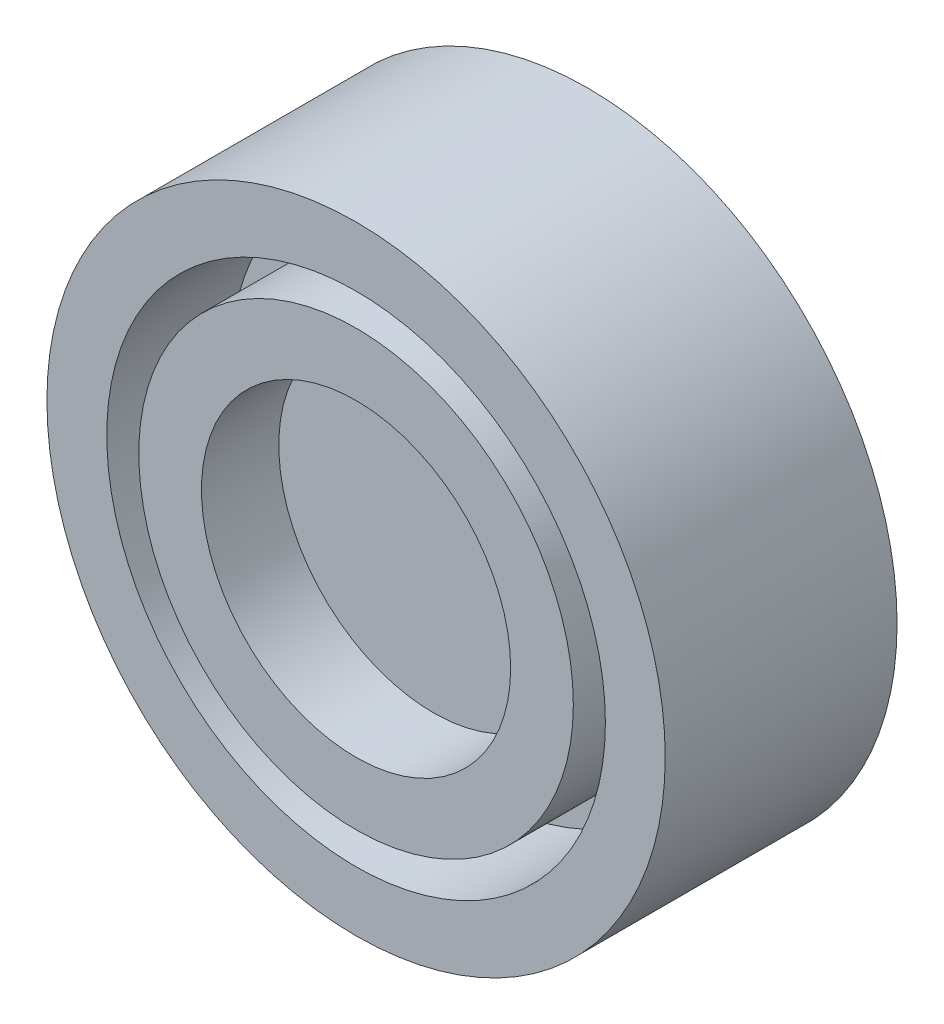
ISO-10303-21;
HEADER;
FILE_DESCRIPTION(('STEP AP214'),'2;1');
FILE_NAME('part.step','',(''),(''),'','','');
FILE_SCHEMA(('AUTOMOTIVE_DESIGN { 1 0 10303 214 1 1 1 1 }'));
ENDSEC;
DATA;
#1=APPLICATION_CONTEXT('core data for automotive mechanical design processes');
#2=APPLICATION_PROTOCOL_DEFINITION('international standard','automotive_design',2000,#1);
#3=PRODUCT_CONTEXT('',#1,'mechanical');
#4=PRODUCT('Part','Part','',(#3));
#5=PRODUCT_RELATED_PRODUCT_CATEGORY('part','',(#4));
#6=PRODUCT_DEFINITION_FORMATION('','',#4);
#7=PRODUCT_DEFINITION_CONTEXT('part definition',#1,'design');
#8=PRODUCT_DEFINITION('design','',#6,#7);
#9=PRODUCT_DEFINITION_SHAPE('','',#8);
#10=(LENGTH_UNIT() NAMED_UNIT(*) SI_UNIT(.MILLI.,.METRE.));
#11=(NAMED_UNIT(*) PLANE_ANGLE_UNIT() SI_UNIT($,.RADIAN.));
#12=(NAMED_UNIT(*) SI_UNIT($,.STERADIAN.) SOLID_ANGLE_UNIT());
#13=UNCERTAINTY_MEASURE_WITH_UNIT(LENGTH_MEASURE(1.E-05),#10,'distance_accuracy_value','');
#14=(GEOMETRIC_REPRESENTATION_CONTEXT(3) GLOBAL_UNCERTAINTY_ASSIGNED_CONTEXT((#13)) GLOBAL_UNIT_ASSIGNED_CONTEXT((#10,
#11,#12)) REPRESENTATION_CONTEXT('',''));
#15=CARTESIAN_POINT('',(0.,0.,0.));
#16=DIRECTION('',(0.,0.,1.));
#17=DIRECTION('',(1.,0.,0.));
#18=AXIS2_PLACEMENT_3D('',#15,#16,#17);
#19=CARTESIAN_POINT('',(0.,0.,15.));
#20=DIRECTION('',(0.,0.,-1.));
#21=DIRECTION('',(-1.,0.,0.));
#22=AXIS2_PLACEMENT_3D('',#19,#20,#21);
#23=CYLINDRICAL_SURFACE('',#22,20.);
#24=CARTESIAN_POINT('',(0.,0.,15.));
#25=DIRECTION('',(0.,0.,1.));
#26=DIRECTION('',(1.,0.,0.));
#27=AXIS2_PLACEMENT_3D('',#24,#25,#26);
#28=CIRCLE('',#27,20.);
#29=CARTESIAN_POINT('',(20.,0.,15.));
#30=VERTEX_POINT('',#29);
#31=EDGE_CURVE('E10',#30,#30,#28,.T.);
#32=ORIENTED_EDGE('',*,*,#31,.F.);
#33=EDGE_LOOP('',(#32));
#34=FACE_BOUND('',#33,.T.);
#35=CARTESIAN_POINT('',(0.,0.,0.));
#36=DIRECTION('',(0.,0.,1.));
#37=DIRECTION('',(1.,0.,0.));
#38=AXIS2_PLACEMENT_3D('',#35,#36,#37);
#39=CIRCLE('',#38,20.);
#40=CARTESIAN_POINT('',(20.,0.,0.));
#41=VERTEX_POINT('',#40);
#42=EDGE_CURVE('E34',#41,#41,#39,.T.);
#43=ORIENTED_EDGE('',*,*,#42,.T.);
#44=EDGE_LOOP('',(#43));
#45=FACE_BOUND('',#44,.T.);
#46=ADVANCED_FACE('F31',(#34,#45),#23,.T.);
#47=CARTESIAN_POINT('',(0.,0.,15.));
#48=DIRECTION('',(0.,0.,1.));
#49=DIRECTION('',(1.,0.,0.));
#50=AXIS2_PLACEMENT_3D('',#47,#48,#49);
#51=PLANE('',#50);
#52=CARTESIAN_POINT('',(0.,0.,15.));
#53=DIRECTION('',(0.,0.,1.));
#54=DIRECTION('',(1.,0.,0.));
#55=AXIS2_PLACEMENT_3D('',#52,#53,#54);
#56=CIRCLE('',#55,16.1294642018818);
#57=CARTESIAN_POINT('',(16.1294642018818,0.,15.));
#58=VERTEX_POINT('',#57);
#59=EDGE_CURVE('E49',#58,#58,#56,.T.);
#60=ORIENTED_EDGE('',*,*,#59,.F.);
#61=EDGE_LOOP('',(#60));
#62=FACE_BOUND('',#61,.T.);
#63=ORIENTED_EDGE('',*,*,#31,.T.);
#64=EDGE_LOOP('',(#63));
#65=FACE_BOUND('',#64,.T.);
#66=ADVANCED_FACE('F77',(#62,#65),#51,.T.);
#67=CARTESIAN_POINT('',(0.,0.,0.));
#68=DIRECTION('',(0.,0.,1.));
#69=DIRECTION('',(1.,0.,0.));
#70=AXIS2_PLACEMENT_3D('',#67,#68,#69);
#71=PLANE('',#70);
#72=ORIENTED_EDGE('',*,*,#42,.F.);
#73=EDGE_LOOP('',(#72));
#74=FACE_BOUND('',#73,.T.);
#75=ADVANCED_FACE('F73',(#74),#71,.F.);
#76=CARTESIAN_POINT('',(0.,0.,7.));
#77=DIRECTION('',(0.,0.,1.));
#78=DIRECTION('',(1.,0.,0.));
#79=AXIS2_PLACEMENT_3D('',#76,#77,#78);
#80=CYLINDRICAL_SURFACE('',#79,16.1294642018818);
#81=CARTESIAN_POINT('',(0.,0.,7.));
#82=DIRECTION('',(0.,0.,1.));
#83=DIRECTION('',(1.,0.,0.));
#84=AXIS2_PLACEMENT_3D('',#81,#82,#83);
#85=CIRCLE('',#84,16.1294642018818);
#86=CARTESIAN_POINT('',(16.1294642018818,0.,7.));
#87=VERTEX_POINT('',#86);
#88=EDGE_CURVE('E46',#87,#87,#85,.T.);
#89=ORIENTED_EDGE('',*,*,#88,.F.);
#90=EDGE_LOOP('',(#89));
#91=FACE_BOUND('',#90,.T.);
#92=ORIENTED_EDGE('',*,*,#59,.T.);
#93=EDGE_LOOP('',(#92));
#94=FACE_BOUND('',#93,.T.);
#95=ADVANCED_FACE('F67',(#91,#94),#80,.F.);
#96=CARTESIAN_POINT('',(0.,0.,7.));
#97=DIRECTION('',(0.,0.,1.));
#98=DIRECTION('',(1.,0.,0.));
#99=AXIS2_PLACEMENT_3D('',#96,#97,#98);
#100=PLANE('',#99);
#101=CARTESIAN_POINT('',(0.,0.,7.));
#102=DIRECTION('',(0.,0.,1.));
#103=DIRECTION('',(1.,0.,0.));
#104=AXIS2_PLACEMENT_3D('',#101,#102,#103);
#105=CIRCLE('',#104,14.0559184604678);
#106=CARTESIAN_POINT('',(14.0559184604678,0.,7.));
#107=VERTEX_POINT('',#106);
#108=EDGE_CURVE('E52',#107,#107,#105,.T.);
#109=ORIENTED_EDGE('',*,*,#108,.F.);
#110=EDGE_LOOP('',(#109));
#111=FACE_BOUND('',#110,.T.);
#112=ORIENTED_EDGE('',*,*,#88,.T.);
#113=EDGE_LOOP('',(#112));
#114=FACE_BOUND('',#113,.T.);
#115=ADVANCED_FACE('F64',(#111,#114),#100,.T.);
#116=CARTESIAN_POINT('',(0.,0.,7.));
#117=DIRECTION('',(0.,0.,1.));
#118=DIRECTION('',(1.,0.,0.));
#119=AXIS2_PLACEMENT_3D('',#116,#117,#118);
#120=CYLINDRICAL_SURFACE('',#119,14.0559184604678);
#121=ORIENTED_EDGE('',*,*,#108,.T.);
#122=EDGE_LOOP('',(#121));
#123=FACE_BOUND('',#122,.T.);
#124=CARTESIAN_POINT('',(0.,0.,15.));
#125=DIRECTION('',(0.,0.,1.));
#126=DIRECTION('',(1.,0.,0.));
#127=AXIS2_PLACEMENT_3D('',#124,#125,#126);
#128=CIRCLE('',#127,14.0559184604678);
#129=CARTESIAN_POINT('',(14.0559184604678,0.,15.));
#130=VERTEX_POINT('',#129);
#131=EDGE_CURVE('E55',#130,#130,#128,.T.);
#132=ORIENTED_EDGE('',*,*,#131,.F.);
#133=EDGE_LOOP('',(#132));
#134=FACE_BOUND('',#133,.T.);
#135=ADVANCED_FACE('F61',(#123,#134),#120,.T.);
#136=CARTESIAN_POINT('',(0.,0.,10.));
#137=DIRECTION('',(0.,0.,1.));
#138=DIRECTION('',(1.,0.,0.));
#139=AXIS2_PLACEMENT_3D('',#136,#137,#138);
#140=PLANE('',#139);
#141=CARTESIAN_POINT('',(0.,0.,10.));
#142=DIRECTION('',(0.,0.,1.));
#143=DIRECTION('',(1.,0.,0.));
#144=AXIS2_PLACEMENT_3D('',#141,#142,#143);
#145=CIRCLE('',#144,10.);
#146=CARTESIAN_POINT('',(10.,0.,10.));
#147=VERTEX_POINT('',#146);
#148=EDGE_CURVE('E41',#147,#147,#145,.T.);
#149=ORIENTED_EDGE('',*,*,#148,.T.);
#150=EDGE_LOOP('',(#149));
#151=FACE_BOUND('',#150,.T.);
#152=ADVANCED_FACE('F94',(#151),#140,.T.);
#153=CARTESIAN_POINT('',(0.,0.,10.));
#154=DIRECTION('',(0.,0.,1.));
#155=DIRECTION('',(1.,0.,0.));
#156=AXIS2_PLACEMENT_3D('',#153,#154,#155);
#157=CYLINDRICAL_SURFACE('',#156,10.);
#158=ORIENTED_EDGE('',*,*,#148,.F.);
#159=EDGE_LOOP('',(#158));
#160=FACE_BOUND('',#159,.T.);
#161=CARTESIAN_POINT('',(0.,0.,15.));
#162=DIRECTION('',(0.,0.,1.));
#163=DIRECTION('',(1.,0.,0.));
#164=AXIS2_PLACEMENT_3D('',#161,#162,#163);
#165=CIRCLE('',#164,10.);
#166=CARTESIAN_POINT('',(10.,0.,15.));
#167=VERTEX_POINT('',#166);
#168=EDGE_CURVE('E43',#167,#167,#165,.T.);
#169=ORIENTED_EDGE('',*,*,#168,.T.);
#170=EDGE_LOOP('',(#169));
#171=FACE_BOUND('',#170,.T.);
#172=ADVANCED_FACE('F89',(#160,#171),#157,.F.);
#173=ORIENTED_EDGE('',*,*,#168,.F.);
#174=EDGE_LOOP('',(#173));
#175=FACE_BOUND('',#174,.T.);
#176=ORIENTED_EDGE('',*,*,#131,.T.);
#177=EDGE_LOOP('',(#176));
#178=FACE_BOUND('',#177,.T.);
#179=ADVANCED_FACE('F80',(#175,#178),#51,.T.);
#180=CLOSED_SHELL('',(#46,#66,#75,#95,#115,#135,#152,#172,#179));
#181=MANIFOLD_SOLID_BREP('B2',#180);
#182=ADVANCED_BREP_SHAPE_REPRESENTATION('',(#18,#181),#14);
#183=SHAPE_DEFINITION_REPRESENTATION(#9,#182);
ENDSEC;
END-ISO-10303-21;
